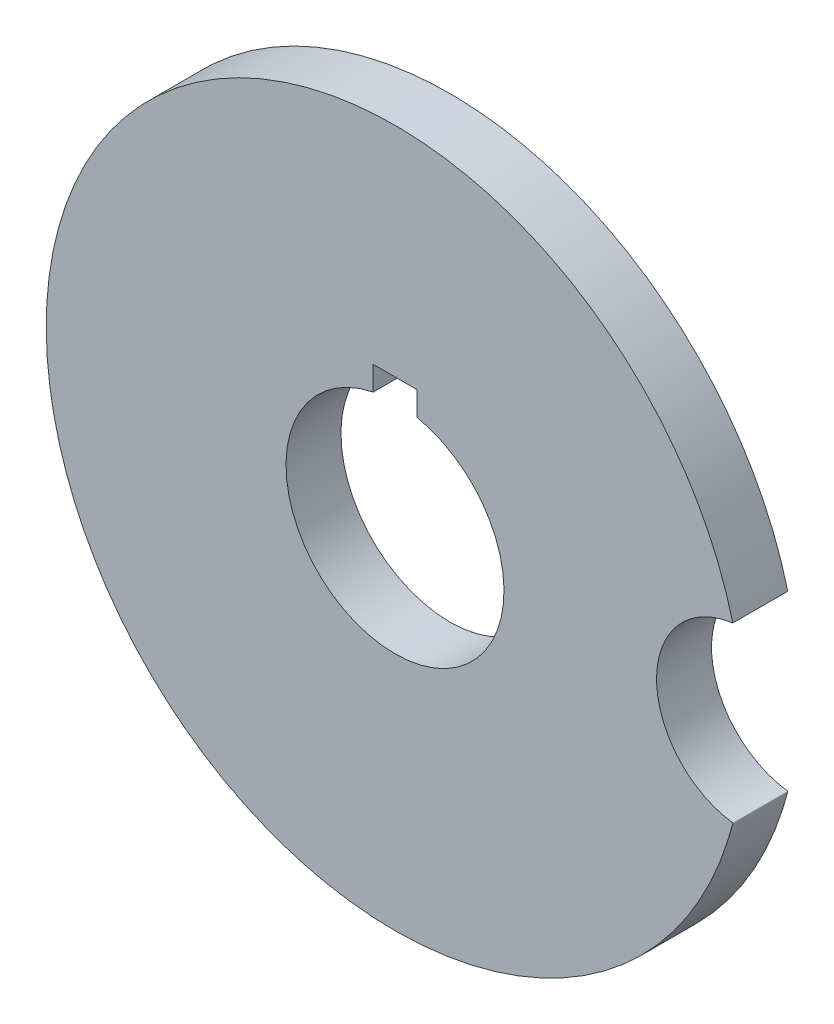
ISO-10303-21;
HEADER;
FILE_DESCRIPTION(('STEP AP214'),'2;1');
FILE_NAME('part.step','',(''),(''),'','','');
FILE_SCHEMA(('AUTOMOTIVE_DESIGN { 1 0 10303 214 1 1 1 1 }'));
ENDSEC;
DATA;
#1=APPLICATION_CONTEXT('core data for automotive mechanical design processes');
#2=APPLICATION_PROTOCOL_DEFINITION('international standard','automotive_design',2000,#1);
#3=PRODUCT_CONTEXT('',#1,'mechanical');
#4=PRODUCT('Part','Part','',(#3));
#5=PRODUCT_RELATED_PRODUCT_CATEGORY('part','',(#4));
#6=PRODUCT_DEFINITION_FORMATION('','',#4);
#7=PRODUCT_DEFINITION_CONTEXT('part definition',#1,'design');
#8=PRODUCT_DEFINITION('design','',#6,#7);
#9=PRODUCT_DEFINITION_SHAPE('','',#8);
#10=(LENGTH_UNIT() NAMED_UNIT(*) SI_UNIT(.MILLI.,.METRE.));
#11=(NAMED_UNIT(*) PLANE_ANGLE_UNIT() SI_UNIT($,.RADIAN.));
#12=(NAMED_UNIT(*) SI_UNIT($,.STERADIAN.) SOLID_ANGLE_UNIT());
#13=UNCERTAINTY_MEASURE_WITH_UNIT(LENGTH_MEASURE(1.E-05),#10,'distance_accuracy_value','');
#14=(GEOMETRIC_REPRESENTATION_CONTEXT(3) GLOBAL_UNCERTAINTY_ASSIGNED_CONTEXT((#13)) GLOBAL_UNIT_ASSIGNED_CONTEXT((#10,
#11,#12)) REPRESENTATION_CONTEXT('',''));
#15=CARTESIAN_POINT('',(0.,0.,0.));
#16=DIRECTION('',(0.,0.,1.));
#17=DIRECTION('',(1.,0.,0.));
#18=AXIS2_PLACEMENT_3D('',#15,#16,#17);
#19=CARTESIAN_POINT('',(-24.4248257391607,-6.97050124536475,4.));
#20=DIRECTION('',(0.,0.,-1.));
#21=DIRECTION('',(-1.,0.,0.));
#22=AXIS2_PLACEMENT_3D('',#19,#20,#21);
#23=PLANE('',#22);
#24=CARTESIAN_POINT('',(24.600591449412,6.3222543715923,4.));
#25=CARTESIAN_POINT('',(14.5720281750026,45.344503942387,4.));
#26=CARTESIAN_POINT('',(-25.4,40.2902971311236,4.));
#27=CARTESIAN_POINT('',(-25.4,0.,4.));
#28=CARTESIAN_POINT('',(-25.4,-40.2902971311236,4.));
#29=CARTESIAN_POINT('',(14.5720281750026,-45.344503942387,4.));
#30=CARTESIAN_POINT('',(24.600591449412,-6.32225437159229,4.));
#31=CARTESIAN_POINT('',(24.6013988632835,-6.31911263486087,4.));
#32=CARTESIAN_POINT('',(24.6030124873349,-6.31282885205404,4.));
#33=CARTESIAN_POINT('',(24.5947708142359,-6.29874094765763,4.));
#34=CARTESIAN_POINT('',(24.5883361593306,-6.29791333158663,4.));
#35=CARTESIAN_POINT('',(24.5851191508509,-6.29749705848999,4.));
#36=CARTESIAN_POINT('',(14.6453563606543,-5.01131585545213,4.));
#37=CARTESIAN_POINT('',(14.6453563606544,5.01131585545214,4.));
#38=CARTESIAN_POINT('',(24.5851191508509,6.29749705848999,4.));
#39=CARTESIAN_POINT('',(24.5883361593306,6.29791333158663,4.));
#40=CARTESIAN_POINT('',(24.5947708142359,6.29874094765763,4.));
#41=CARTESIAN_POINT('',(24.6030124873349,6.31282885205405,4.));
#42=CARTESIAN_POINT('',(24.6013988632835,6.31911263486088,4.));
#43=CARTESIAN_POINT('',(24.600591449412,6.3222543715923,4.));
#44=(BOUNDED_CURVE() B_SPLINE_CURVE(3,(#24,#25,#26,#27,#28,#29,#30,#31,#32,#33,#34,#35,#36,#37,
#38,#39,#40,#41,#42,#43),.UNSPECIFIED.,.T.,.F.) B_SPLINE_CURVE_WITH_KNOTS((4,3,3,1,1,3,3,1,1,4),
(0.,0.444234053296301,0.888468106592602,0.888553883746522,0.888639660900443,0.888725438054363,
0.999742668538238,0.999828445692159,0.999914222846079,1.),
.UNSPECIFIED.) CURVE() GEOMETRIC_REPRESENTATION_ITEM() RATIONAL_B_SPLINE_CURVE((1.,
0.416963175936458,0.416963175936458,1.,0.416963175936458,0.416963175936458,1.,1.,1.,1.,1.,1.,
0.418885128519591,0.418885128519591,1.,1.,1.,1.,1.,1.)) REPRESENTATION_ITEM(''));
#45=CARTESIAN_POINT('',(24.600591449412,6.3222543715923,4.));
#46=VERTEX_POINT('',#45);
#47=EDGE_CURVE('E11',#46,#46,#44,.T.);
#48=ORIENTED_EDGE('',*,*,#47,.T.);
#49=EDGE_LOOP('',(#48));
#50=FACE_BOUND('',#49,.T.);
#51=DIRECTION('',(0.,-1.,0.));
#52=VECTOR('',#51,1.);
#53=CARTESIAN_POINT('',(-1.5875,7.77712993333659,4.));
#54=LINE('',#53,#52);
#55=CARTESIAN_POINT('',(-1.5875,9.525,4.));
#56=VERTEX_POINT('',#55);
#57=CARTESIAN_POINT('',(-1.5875,7.77712993333659,4.));
#58=VERTEX_POINT('',#57);
#59=EDGE_CURVE('E76',#56,#58,#54,.T.);
#60=ORIENTED_EDGE('',*,*,#59,.F.);
#61=DIRECTION('',(-1.,0.,0.));
#62=VECTOR('',#61,1.);
#63=CARTESIAN_POINT('',(1.5875,9.525,4.));
#64=LINE('',#63,#62);
#65=CARTESIAN_POINT('',(1.5875,9.525,4.));
#66=VERTEX_POINT('',#65);
#67=EDGE_CURVE('E97',#66,#56,#64,.T.);
#68=ORIENTED_EDGE('',*,*,#67,.F.);
#69=DIRECTION('',(0.,1.,0.));
#70=VECTOR('',#69,1.);
#71=CARTESIAN_POINT('',(1.5875,7.77712993333659,4.));
#72=LINE('',#71,#70);
#73=CARTESIAN_POINT('',(1.5875,7.77712993333659,4.));
#74=VERTEX_POINT('',#73);
#75=EDGE_CURVE('E95',#74,#66,#72,.T.);
#76=ORIENTED_EDGE('',*,*,#75,.F.);
#77=CARTESIAN_POINT('',(0.,0.,4.));
#78=DIRECTION('',(0.,0.,1.));
#79=DIRECTION('',(1.,0.,0.));
#80=AXIS2_PLACEMENT_3D('',#77,#78,#79);
#81=CIRCLE('',#80,7.9375);
#82=EDGE_CURVE('E84',#58,#74,#81,.T.);
#83=ORIENTED_EDGE('',*,*,#82,.F.);
#84=EDGE_LOOP('',(#60,#68,#76,#83));
#85=FACE_BOUND('',#84,.T.);
#86=ADVANCED_FACE('F33',(#50,#85),#23,.F.);
#87=CARTESIAN_POINT('',(-24.4248257391607,-6.97050124536475,0.));
#88=DIRECTION('',(0.,0.,-1.));
#89=DIRECTION('',(-1.,0.,0.));
#90=AXIS2_PLACEMENT_3D('',#87,#88,#89);
#91=PLANE('',#90);
#92=CARTESIAN_POINT('',(24.600591449412,6.3222543715923,0.));
#93=CARTESIAN_POINT('',(14.5720281750026,45.344503942387,0.));
#94=CARTESIAN_POINT('',(-25.4,40.2902971311236,0.));
#95=CARTESIAN_POINT('',(-25.4,0.,0.));
#96=CARTESIAN_POINT('',(-25.4,-40.2902971311236,0.));
#97=CARTESIAN_POINT('',(14.5720281750026,-45.344503942387,0.));
#98=CARTESIAN_POINT('',(24.600591449412,-6.32225437159229,0.));
#99=CARTESIAN_POINT('',(24.6013988632835,-6.31911263486087,0.));
#100=CARTESIAN_POINT('',(24.6030124873349,-6.31282885205404,0.));
#101=CARTESIAN_POINT('',(24.5947708142359,-6.29874094765763,0.));
#102=CARTESIAN_POINT('',(24.5883361593306,-6.29791333158663,0.));
#103=CARTESIAN_POINT('',(24.5851191508509,-6.29749705848999,0.));
#104=CARTESIAN_POINT('',(14.6453563606543,-5.01131585545213,0.));
#105=CARTESIAN_POINT('',(14.6453563606544,5.01131585545214,0.));
#106=CARTESIAN_POINT('',(24.5851191508509,6.29749705848999,0.));
#107=CARTESIAN_POINT('',(24.5883361593306,6.29791333158663,0.));
#108=CARTESIAN_POINT('',(24.5947708142359,6.29874094765763,0.));
#109=CARTESIAN_POINT('',(24.6030124873349,6.31282885205405,0.));
#110=CARTESIAN_POINT('',(24.6013988632835,6.31911263486088,0.));
#111=CARTESIAN_POINT('',(24.600591449412,6.3222543715923,0.));
#112=(BOUNDED_CURVE() B_SPLINE_CURVE(3,(#92,#93,#94,#95,#96,#97,#98,#99,#100,#101,#102,#103,
#104,#105,#106,#107,#108,#109,#110,#111),.UNSPECIFIED.,.T.,.F.) B_SPLINE_CURVE_WITH_KNOTS((4,3,
3,1,1,3,3,1,1,4),(0.,0.444234053296301,0.888468106592602,0.888553883746522,0.888639660900443,
0.888725438054363,0.999742668538238,0.999828445692159,0.999914222846079,1.),
.UNSPECIFIED.) CURVE() GEOMETRIC_REPRESENTATION_ITEM() RATIONAL_B_SPLINE_CURVE((1.,
0.416963175936458,0.416963175936458,1.,0.416963175936458,0.416963175936458,1.,1.,1.,1.,1.,1.,
0.418885128519591,0.418885128519591,1.,1.,1.,1.,1.,1.)) REPRESENTATION_ITEM(''));
#113=CARTESIAN_POINT('',(24.600591449412,6.3222543715923,0.));
#114=VERTEX_POINT('',#113);
#115=EDGE_CURVE('E38',#114,#114,#112,.T.);
#116=ORIENTED_EDGE('',*,*,#115,.F.);
#117=EDGE_LOOP('',(#116));
#118=FACE_BOUND('',#117,.T.);
#119=DIRECTION('',(-1.,0.,0.));
#120=VECTOR('',#119,1.);
#121=CARTESIAN_POINT('',(1.5875,9.525,0.));
#122=LINE('',#121,#120);
#123=CARTESIAN_POINT('',(1.5875,9.525,0.));
#124=VERTEX_POINT('',#123);
#125=CARTESIAN_POINT('',(-1.5875,9.525,0.));
#126=VERTEX_POINT('',#125);
#127=EDGE_CURVE('E85',#124,#126,#122,.T.);
#128=ORIENTED_EDGE('',*,*,#127,.T.);
#129=DIRECTION('',(0.,-1.,0.));
#130=VECTOR('',#129,1.);
#131=CARTESIAN_POINT('',(-1.5875,7.77712993333659,0.));
#132=LINE('',#131,#130);
#133=CARTESIAN_POINT('',(-1.5875,7.77712993333659,0.));
#134=VERTEX_POINT('',#133);
#135=EDGE_CURVE('E58',#126,#134,#132,.T.);
#136=ORIENTED_EDGE('',*,*,#135,.T.);
#137=CARTESIAN_POINT('',(0.,0.,0.));
#138=DIRECTION('',(0.,0.,1.));
#139=DIRECTION('',(1.,0.,0.));
#140=AXIS2_PLACEMENT_3D('',#137,#138,#139);
#141=CIRCLE('',#140,7.9375);
#142=CARTESIAN_POINT('',(1.5875,7.77712993333659,0.));
#143=VERTEX_POINT('',#142);
#144=EDGE_CURVE('E91',#134,#143,#141,.T.);
#145=ORIENTED_EDGE('',*,*,#144,.T.);
#146=DIRECTION('',(0.,1.,0.));
#147=VECTOR('',#146,1.);
#148=CARTESIAN_POINT('',(1.5875,7.77712993333659,0.));
#149=LINE('',#148,#147);
#150=EDGE_CURVE('E103',#143,#124,#149,.T.);
#151=ORIENTED_EDGE('',*,*,#150,.T.);
#152=EDGE_LOOP('',(#128,#136,#145,#151));
#153=FACE_BOUND('',#152,.T.);
#154=ADVANCED_FACE('F120',(#118,#153),#91,.T.);
#155=DIRECTION('',(0.,0.,-1.));
#156=VECTOR('',#155,1.);
#157=SURFACE_OF_LINEAR_EXTRUSION('',#44,#156);
#158=ORIENTED_EDGE('',*,*,#47,.F.);
#159=EDGE_LOOP('',(#158));
#160=FACE_BOUND('',#159,.T.);
#161=ORIENTED_EDGE('',*,*,#115,.T.);
#162=EDGE_LOOP('',(#161));
#163=FACE_BOUND('',#162,.T.);
#164=ADVANCED_FACE('F35',(#160,#163),#157,.F.);
#165=CARTESIAN_POINT('',(-1.5875,7.77712993333659,4.));
#166=DIRECTION('',(1.,0.,0.));
#167=DIRECTION('',(0.,0.,-1.));
#168=AXIS2_PLACEMENT_3D('',#165,#166,#167);
#169=PLANE('',#168);
#170=ORIENTED_EDGE('',*,*,#135,.F.);
#171=DIRECTION('',(0.,0.,-1.));
#172=VECTOR('',#171,1.);
#173=CARTESIAN_POINT('',(-1.5875,9.525,4.));
#174=LINE('',#173,#172);
#175=EDGE_CURVE('E80',#56,#126,#174,.T.);
#176=ORIENTED_EDGE('',*,*,#175,.F.);
#177=ORIENTED_EDGE('',*,*,#59,.T.);
#178=DIRECTION('',(0.,0.,-1.));
#179=VECTOR('',#178,1.);
#180=CARTESIAN_POINT('',(-1.5875,7.77712993333659,4.));
#181=LINE('',#180,#179);
#182=EDGE_CURVE('E79',#58,#134,#181,.T.);
#183=ORIENTED_EDGE('',*,*,#182,.T.);
#184=EDGE_LOOP('',(#170,#176,#177,#183));
#185=FACE_BOUND('',#184,.T.);
#186=ADVANCED_FACE('F78',(#185),#169,.T.);
#187=CARTESIAN_POINT('',(0.,0.,4.));
#188=DIRECTION('',(0.,0.,-1.));
#189=DIRECTION('',(-1.,0.,0.));
#190=AXIS2_PLACEMENT_3D('',#187,#188,#189);
#191=CYLINDRICAL_SURFACE('',#190,7.9375);
#192=ORIENTED_EDGE('',*,*,#144,.F.);
#193=ORIENTED_EDGE('',*,*,#182,.F.);
#194=ORIENTED_EDGE('',*,*,#82,.T.);
#195=DIRECTION('',(0.,0.,-1.));
#196=VECTOR('',#195,1.);
#197=CARTESIAN_POINT('',(1.5875,7.77712993333659,4.));
#198=LINE('',#197,#196);
#199=EDGE_CURVE('E92',#74,#143,#198,.T.);
#200=ORIENTED_EDGE('',*,*,#199,.T.);
#201=EDGE_LOOP('',(#192,#193,#194,#200));
#202=FACE_BOUND('',#201,.T.);
#203=ADVANCED_FACE('F88',(#202),#191,.F.);
#204=CARTESIAN_POINT('',(1.5875,7.77712993333659,4.));
#205=DIRECTION('',(-1.,0.,0.));
#206=DIRECTION('',(0.,0.,1.));
#207=AXIS2_PLACEMENT_3D('',#204,#205,#206);
#208=PLANE('',#207);
#209=ORIENTED_EDGE('',*,*,#150,.F.);
#210=ORIENTED_EDGE('',*,*,#199,.F.);
#211=ORIENTED_EDGE('',*,*,#75,.T.);
#212=DIRECTION('',(0.,0.,-1.));
#213=VECTOR('',#212,1.);
#214=CARTESIAN_POINT('',(1.5875,9.525,4.));
#215=LINE('',#214,#213);
#216=EDGE_CURVE('E50',#66,#124,#215,.T.);
#217=ORIENTED_EDGE('',*,*,#216,.T.);
#218=EDGE_LOOP('',(#209,#210,#211,#217));
#219=FACE_BOUND('',#218,.T.);
#220=ADVANCED_FACE('F118',(#219),#208,.T.);
#221=CARTESIAN_POINT('',(1.5875,9.525,4.));
#222=DIRECTION('',(0.,-1.,0.));
#223=DIRECTION('',(0.,0.,-1.));
#224=AXIS2_PLACEMENT_3D('',#221,#222,#223);
#225=PLANE('',#224);
#226=ORIENTED_EDGE('',*,*,#127,.F.);
#227=ORIENTED_EDGE('',*,*,#216,.F.);
#228=ORIENTED_EDGE('',*,*,#67,.T.);
#229=ORIENTED_EDGE('',*,*,#175,.T.);
#230=EDGE_LOOP('',(#226,#227,#228,#229));
#231=FACE_BOUND('',#230,.T.);
#232=ADVANCED_FACE('F121',(#231),#225,.T.);
#233=CLOSED_SHELL('',(#86,#154,#164,#186,#203,#220,#232));
#234=MANIFOLD_SOLID_BREP('B2',#233);
#235=ADVANCED_BREP_SHAPE_REPRESENTATION('',(#18,#234),#14);
#236=SHAPE_DEFINITION_REPRESENTATION(#9,#235);
ENDSEC;
END-ISO-10303-21;
